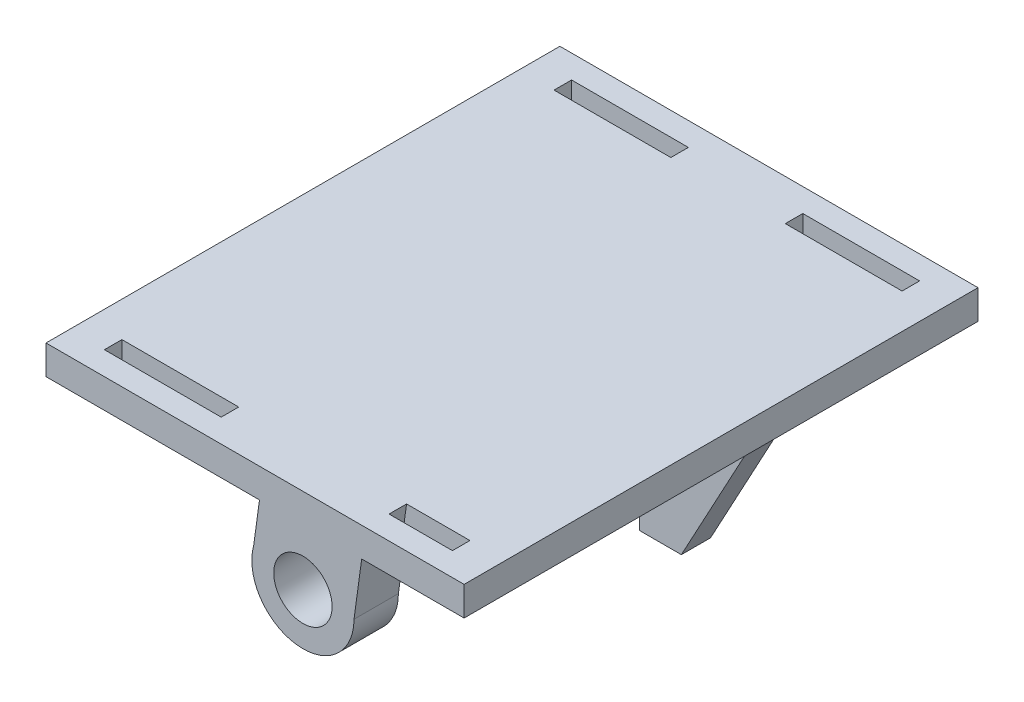
ISO-10303-21;
HEADER;
FILE_DESCRIPTION(('STEP AP214'),'2;1');
FILE_NAME('part.step','',(''),(''),'','','');
FILE_SCHEMA(('AUTOMOTIVE_DESIGN { 1 0 10303 214 1 1 1 1 }'));
ENDSEC;
DATA;
#1=APPLICATION_CONTEXT('core data for automotive mechanical design processes');
#2=APPLICATION_PROTOCOL_DEFINITION('international standard','automotive_design',2000,#1);
#3=PRODUCT_CONTEXT('',#1,'mechanical');
#4=PRODUCT('Part','Part','',(#3));
#5=PRODUCT_RELATED_PRODUCT_CATEGORY('part','',(#4));
#6=PRODUCT_DEFINITION_FORMATION('','',#4);
#7=PRODUCT_DEFINITION_CONTEXT('part definition',#1,'design');
#8=PRODUCT_DEFINITION('design','',#6,#7);
#9=PRODUCT_DEFINITION_SHAPE('','',#8);
#10=(LENGTH_UNIT() NAMED_UNIT(*) SI_UNIT(.MILLI.,.METRE.));
#11=(NAMED_UNIT(*) PLANE_ANGLE_UNIT() SI_UNIT($,.RADIAN.));
#12=(NAMED_UNIT(*) SI_UNIT($,.STERADIAN.) SOLID_ANGLE_UNIT());
#13=UNCERTAINTY_MEASURE_WITH_UNIT(LENGTH_MEASURE(1.E-05),#10,'distance_accuracy_value','');
#14=(GEOMETRIC_REPRESENTATION_CONTEXT(3) GLOBAL_UNCERTAINTY_ASSIGNED_CONTEXT((#13)) GLOBAL_UNIT_ASSIGNED_CONTEXT((#10,
#11,#12)) REPRESENTATION_CONTEXT('',''));
#15=CARTESIAN_POINT('',(0.,0.,0.));
#16=DIRECTION('',(0.,0.,1.));
#17=DIRECTION('',(1.,0.,0.));
#18=AXIS2_PLACEMENT_3D('',#15,#16,#17);
#19=CARTESIAN_POINT('',(0.,0.,0.));
#20=DIRECTION('',(0.,-1.,0.));
#21=DIRECTION('',(0.,0.,-1.));
#22=AXIS2_PLACEMENT_3D('',#19,#20,#21);
#23=PLANE('',#22);
#24=DIRECTION('',(0.,0.,1.));
#25=VECTOR('',#24,1.);
#26=CARTESIAN_POINT('',(34.32750606469,0.,0.));
#27=LINE('',#26,#25);
#28=CARTESIAN_POINT('',(34.32750606469,0.,-2.54));
#29=VERTEX_POINT('',#28);
#30=CARTESIAN_POINT('',(34.32750606469,0.,0.));
#31=VERTEX_POINT('',#30);
#32=EDGE_CURVE('E290',#29,#31,#27,.T.);
#33=ORIENTED_EDGE('',*,*,#32,.F.);
#34=DIRECTION('',(1.,0.,0.));
#35=VECTOR('',#34,1.);
#36=CARTESIAN_POINT('',(41.656,0.,-2.54));
#37=LINE('',#36,#35);
#38=CARTESIAN_POINT('',(41.656,0.,-2.54));
#39=VERTEX_POINT('',#38);
#40=EDGE_CURVE('E446',#29,#39,#37,.T.);
#41=ORIENTED_EDGE('',*,*,#40,.T.);
#42=DIRECTION('',(0.,0.,-1.));
#43=VECTOR('',#42,1.);
#44=CARTESIAN_POINT('',(41.656,0.,-2.54));
#45=LINE('',#44,#43);
#46=CARTESIAN_POINT('',(41.656,0.,-4.445));
#47=VERTEX_POINT('',#46);
#48=EDGE_CURVE('E442',#39,#47,#45,.T.);
#49=ORIENTED_EDGE('',*,*,#48,.T.);
#50=DIRECTION('',(-1.,0.,0.));
#51=VECTOR('',#50,1.);
#52=CARTESIAN_POINT('',(41.656,0.,-4.445));
#53=LINE('',#52,#51);
#54=CARTESIAN_POINT('',(34.32750606469,0.,-4.445));
#55=VERTEX_POINT('',#54);
#56=EDGE_CURVE('E453',#47,#55,#53,.T.);
#57=ORIENTED_EDGE('',*,*,#56,.T.);
#58=CARTESIAN_POINT('',(34.32750606469,0.,-4.826));
#59=VERTEX_POINT('',#58);
#60=EDGE_CURVE('E61',#59,#55,#27,.T.);
#61=ORIENTED_EDGE('',*,*,#60,.F.);
#62=DIRECTION('',(-1.,0.,0.));
#63=VECTOR('',#62,1.);
#64=CARTESIAN_POINT('',(0.,0.,-4.826));
#65=LINE('',#64,#63);
#66=CARTESIAN_POINT('',(23.21500606469,0.,-4.826));
#67=VERTEX_POINT('',#66);
#68=EDGE_CURVE('E56',#59,#67,#65,.T.);
#69=ORIENTED_EDGE('',*,*,#68,.T.);
#70=DIRECTION('',(0.,0.,1.));
#71=VECTOR('',#70,1.);
#72=CARTESIAN_POINT('',(23.21500606469,0.,0.));
#73=LINE('',#72,#71);
#74=CARTESIAN_POINT('',(23.21500606469,0.,0.));
#75=VERTEX_POINT('',#74);
#76=EDGE_CURVE('E265',#67,#75,#73,.T.);
#77=ORIENTED_EDGE('',*,*,#76,.T.);
#78=DIRECTION('',(1.,0.,0.));
#79=VECTOR('',#78,1.);
#80=CARTESIAN_POINT('',(0.,0.,0.));
#81=LINE('',#80,#79);
#82=CARTESIAN_POINT('',(0.,0.,0.));
#83=VERTEX_POINT('',#82);
#84=EDGE_CURVE('E537',#83,#75,#81,.T.);
#85=ORIENTED_EDGE('',*,*,#84,.F.);
#86=DIRECTION('',(0.,0.,1.));
#87=VECTOR('',#86,1.);
#88=CARTESIAN_POINT('',(0.,0.,0.));
#89=LINE('',#88,#87);
#90=CARTESIAN_POINT('',(0.,0.,-30.48));
#91=VERTEX_POINT('',#90);
#92=EDGE_CURVE('E523',#91,#83,#89,.T.);
#93=ORIENTED_EDGE('',*,*,#92,.F.);
#94=DIRECTION('',(1.,0.,0.));
#95=VECTOR('',#94,1.);
#96=CARTESIAN_POINT('',(0.,0.,-30.48));
#97=LINE('',#96,#95);
#98=CARTESIAN_POINT('',(11.43,0.,-30.48));
#99=VERTEX_POINT('',#98);
#100=EDGE_CURVE('E311',#91,#99,#97,.T.);
#101=ORIENTED_EDGE('',*,*,#100,.T.);
#102=DIRECTION('',(0.,0.,-1.));
#103=VECTOR('',#102,1.);
#104=CARTESIAN_POINT('',(11.43,0.,-30.48));
#105=LINE('',#104,#103);
#106=CARTESIAN_POINT('',(11.43,0.,-33.655));
#107=VERTEX_POINT('',#106);
#108=EDGE_CURVE('E318',#99,#107,#105,.T.);
#109=ORIENTED_EDGE('',*,*,#108,.T.);
#110=DIRECTION('',(1.,0.,0.));
#111=VECTOR('',#110,1.);
#112=CARTESIAN_POINT('',(0.,0.,-33.655));
#113=LINE('',#112,#111);
#114=CARTESIAN_POINT('',(0.,0.,-33.655));
#115=VERTEX_POINT('',#114);
#116=EDGE_CURVE('E315',#115,#107,#113,.T.);
#117=ORIENTED_EDGE('',*,*,#116,.F.);
#118=CARTESIAN_POINT('',(0.,0.,-55.88));
#119=VERTEX_POINT('',#118);
#120=EDGE_CURVE('E541',#119,#115,#89,.T.);
#121=ORIENTED_EDGE('',*,*,#120,.F.);
#122=DIRECTION('',(-1.,0.,0.));
#123=VECTOR('',#122,1.);
#124=CARTESIAN_POINT('',(0.,0.,-55.88));
#125=LINE('',#124,#123);
#126=CARTESIAN_POINT('',(45.466,0.,-55.88));
#127=VERTEX_POINT('',#126);
#128=EDGE_CURVE('E528',#127,#119,#125,.T.);
#129=ORIENTED_EDGE('',*,*,#128,.F.);
#130=DIRECTION('',(0.,0.,-1.));
#131=VECTOR('',#130,1.);
#132=CARTESIAN_POINT('',(45.466,0.,0.));
#133=LINE('',#132,#131);
#134=CARTESIAN_POINT('',(45.466,0.,-33.655));
#135=VERTEX_POINT('',#134);
#136=EDGE_CURVE('E545',#135,#127,#133,.T.);
#137=ORIENTED_EDGE('',*,*,#136,.F.);
#138=DIRECTION('',(-1.,0.,0.));
#139=VECTOR('',#138,1.);
#140=CARTESIAN_POINT('',(45.466,0.,-33.655));
#141=LINE('',#140,#139);
#142=CARTESIAN_POINT('',(34.036,0.,-33.655));
#143=VERTEX_POINT('',#142);
#144=EDGE_CURVE('E371',#135,#143,#141,.T.);
#145=ORIENTED_EDGE('',*,*,#144,.T.);
#146=DIRECTION('',(0.,0.,-1.));
#147=VECTOR('',#146,1.);
#148=CARTESIAN_POINT('',(34.036,0.,-30.48));
#149=LINE('',#148,#147);
#150=CARTESIAN_POINT('',(34.036,0.,-30.48));
#151=VERTEX_POINT('',#150);
#152=EDGE_CURVE('E374',#151,#143,#149,.T.);
#153=ORIENTED_EDGE('',*,*,#152,.F.);
#154=DIRECTION('',(-1.,0.,0.));
#155=VECTOR('',#154,1.);
#156=CARTESIAN_POINT('',(45.466,0.,-30.48));
#157=LINE('',#156,#155);
#158=CARTESIAN_POINT('',(45.466,0.,-30.48));
#159=VERTEX_POINT('',#158);
#160=EDGE_CURVE('E367',#159,#151,#157,.T.);
#161=ORIENTED_EDGE('',*,*,#160,.F.);
#162=CARTESIAN_POINT('',(45.466,0.,0.));
#163=VERTEX_POINT('',#162);
#164=EDGE_CURVE('E547',#163,#159,#133,.T.);
#165=ORIENTED_EDGE('',*,*,#164,.F.);
#166=EDGE_CURVE('E544',#31,#163,#81,.T.);
#167=ORIENTED_EDGE('',*,*,#166,.F.);
#168=EDGE_LOOP('',(#33,#41,#49,#57,#61,#69,#77,#85,#93,#101,#109,#117,#121,#129,#137,#145,#153,
#161,#165,#167));
#169=FACE_BOUND('',#168,.T.);
#170=DIRECTION('',(-1.,0.,0.));
#171=VECTOR('',#170,1.);
#172=CARTESIAN_POINT('',(3.81,0.,-53.34));
#173=LINE('',#172,#171);
#174=CARTESIAN_POINT('',(16.51,0.,-53.34));
#175=VERTEX_POINT('',#174);
#176=CARTESIAN_POINT('',(3.81,0.,-53.34));
#177=VERTEX_POINT('',#176);
#178=EDGE_CURVE('E496',#175,#177,#173,.T.);
#179=ORIENTED_EDGE('',*,*,#178,.T.);
#180=DIRECTION('',(0.,0.,1.));
#181=VECTOR('',#180,1.);
#182=CARTESIAN_POINT('',(3.81,0.,-53.34));
#183=LINE('',#182,#181);
#184=CARTESIAN_POINT('',(3.81,0.,-51.435));
#185=VERTEX_POINT('',#184);
#186=EDGE_CURVE('E492',#177,#185,#183,.T.);
#187=ORIENTED_EDGE('',*,*,#186,.T.);
#188=DIRECTION('',(1.,0.,0.));
#189=VECTOR('',#188,1.);
#190=CARTESIAN_POINT('',(3.81,0.,-51.435));
#191=LINE('',#190,#189);
#192=CARTESIAN_POINT('',(16.51,0.,-51.435));
#193=VERTEX_POINT('',#192);
#194=EDGE_CURVE('E506',#185,#193,#191,.T.);
#195=ORIENTED_EDGE('',*,*,#194,.T.);
#196=DIRECTION('',(0.,0.,-1.));
#197=VECTOR('',#196,1.);
#198=CARTESIAN_POINT('',(16.51,0.,-53.34));
#199=LINE('',#198,#197);
#200=EDGE_CURVE('E509',#193,#175,#199,.T.);
#201=ORIENTED_EDGE('',*,*,#200,.T.);
#202=EDGE_LOOP('',(#179,#187,#195,#201));
#203=FACE_BOUND('',#202,.T.);
#204=DIRECTION('',(0.,0.,-1.));
#205=VECTOR('',#204,1.);
#206=CARTESIAN_POINT('',(41.656,0.,-53.34));
#207=LINE('',#206,#205);
#208=CARTESIAN_POINT('',(41.656,0.,-51.435));
#209=VERTEX_POINT('',#208);
#210=CARTESIAN_POINT('',(41.656,0.,-53.34));
#211=VERTEX_POINT('',#210);
#212=EDGE_CURVE('E465',#209,#211,#207,.T.);
#213=ORIENTED_EDGE('',*,*,#212,.T.);
#214=DIRECTION('',(-1.,0.,0.));
#215=VECTOR('',#214,1.);
#216=CARTESIAN_POINT('',(41.656,0.,-53.34));
#217=LINE('',#216,#215);
#218=CARTESIAN_POINT('',(28.956,0.,-53.34));
#219=VERTEX_POINT('',#218);
#220=EDGE_CURVE('E461',#211,#219,#217,.T.);
#221=ORIENTED_EDGE('',*,*,#220,.T.);
#222=DIRECTION('',(0.,0.,1.));
#223=VECTOR('',#222,1.);
#224=CARTESIAN_POINT('',(28.956,0.,-53.34));
#225=LINE('',#224,#223);
#226=CARTESIAN_POINT('',(28.956,0.,-51.435));
#227=VERTEX_POINT('',#226);
#228=EDGE_CURVE('E475',#219,#227,#225,.T.);
#229=ORIENTED_EDGE('',*,*,#228,.T.);
#230=DIRECTION('',(1.,0.,0.));
#231=VECTOR('',#230,1.);
#232=CARTESIAN_POINT('',(41.656,0.,-51.435));
#233=LINE('',#232,#231);
#234=EDGE_CURVE('E478',#227,#209,#233,.T.);
#235=ORIENTED_EDGE('',*,*,#234,.T.);
#236=EDGE_LOOP('',(#213,#221,#229,#235));
#237=FACE_BOUND('',#236,.T.);
#238=DIRECTION('',(0.,0.,1.));
#239=VECTOR('',#238,1.);
#240=CARTESIAN_POINT('',(3.81,0.,-2.54));
#241=LINE('',#240,#239);
#242=CARTESIAN_POINT('',(3.81,0.,-4.445));
#243=VERTEX_POINT('',#242);
#244=CARTESIAN_POINT('',(3.81,0.,-2.54));
#245=VERTEX_POINT('',#244);
#246=EDGE_CURVE('E415',#243,#245,#241,.T.);
#247=ORIENTED_EDGE('',*,*,#246,.T.);
#248=DIRECTION('',(1.,0.,0.));
#249=VECTOR('',#248,1.);
#250=CARTESIAN_POINT('',(3.81,0.,-2.54));
#251=LINE('',#250,#249);
#252=CARTESIAN_POINT('',(16.51,0.,-2.54));
#253=VERTEX_POINT('',#252);
#254=EDGE_CURVE('E370',#245,#253,#251,.T.);
#255=ORIENTED_EDGE('',*,*,#254,.T.);
#256=DIRECTION('',(0.,0.,-1.));
#257=VECTOR('',#256,1.);
#258=CARTESIAN_POINT('',(16.51,0.,-2.54));
#259=LINE('',#258,#257);
#260=CARTESIAN_POINT('',(16.51,0.,-4.445));
#261=VERTEX_POINT('',#260);
#262=EDGE_CURVE('E425',#253,#261,#259,.T.);
#263=ORIENTED_EDGE('',*,*,#262,.T.);
#264=DIRECTION('',(-1.,0.,0.));
#265=VECTOR('',#264,1.);
#266=CARTESIAN_POINT('',(3.81,0.,-4.445));
#267=LINE('',#266,#265);
#268=EDGE_CURVE('E428',#261,#243,#267,.T.);
#269=ORIENTED_EDGE('',*,*,#268,.T.);
#270=EDGE_LOOP('',(#247,#255,#263,#269));
#271=FACE_BOUND('',#270,.T.);
#272=ADVANCED_FACE('F41',(#169,#203,#237,#271),#23,.T.);
#273=CARTESIAN_POINT('',(0.,3.175,0.));
#274=DIRECTION('',(0.,-1.,0.));
#275=DIRECTION('',(0.,0.,-1.));
#276=AXIS2_PLACEMENT_3D('',#273,#274,#275);
#277=PLANE('',#276);
#278=DIRECTION('',(1.,0.,0.));
#279=VECTOR('',#278,1.);
#280=CARTESIAN_POINT('',(0.,3.175,0.));
#281=LINE('',#280,#279);
#282=CARTESIAN_POINT('',(0.,3.175,0.));
#283=VERTEX_POINT('',#282);
#284=CARTESIAN_POINT('',(45.466,3.175,0.));
#285=VERTEX_POINT('',#284);
#286=EDGE_CURVE('E527',#283,#285,#281,.T.);
#287=ORIENTED_EDGE('',*,*,#286,.T.);
#288=DIRECTION('',(0.,0.,-1.));
#289=VECTOR('',#288,1.);
#290=CARTESIAN_POINT('',(45.466,3.175,0.));
#291=LINE('',#290,#289);
#292=CARTESIAN_POINT('',(45.466,3.175,-55.88));
#293=VERTEX_POINT('',#292);
#294=EDGE_CURVE('E530',#285,#293,#291,.T.);
#295=ORIENTED_EDGE('',*,*,#294,.T.);
#296=DIRECTION('',(-1.,0.,0.));
#297=VECTOR('',#296,1.);
#298=CARTESIAN_POINT('',(0.,3.175,-55.88));
#299=LINE('',#298,#297);
#300=CARTESIAN_POINT('',(0.,3.175,-55.88));
#301=VERTEX_POINT('',#300);
#302=EDGE_CURVE('E532',#293,#301,#299,.T.);
#303=ORIENTED_EDGE('',*,*,#302,.T.);
#304=DIRECTION('',(0.,0.,1.));
#305=VECTOR('',#304,1.);
#306=CARTESIAN_POINT('',(0.,3.175,0.));
#307=LINE('',#306,#305);
#308=EDGE_CURVE('E524',#301,#283,#307,.T.);
#309=ORIENTED_EDGE('',*,*,#308,.T.);
#310=EDGE_LOOP('',(#287,#295,#303,#309));
#311=FACE_BOUND('',#310,.T.);
#312=DIRECTION('',(0.,0.,1.));
#313=VECTOR('',#312,1.);
#314=CARTESIAN_POINT('',(34.76225,3.175,-4.826));
#315=LINE('',#314,#313);
#316=CARTESIAN_POINT('',(34.76225,3.175,-4.445));
#317=VERTEX_POINT('',#316);
#318=CARTESIAN_POINT('',(34.76225,3.175,-2.54));
#319=VERTEX_POINT('',#318);
#320=EDGE_CURVE('E287',#317,#319,#315,.T.);
#321=ORIENTED_EDGE('',*,*,#320,.F.);
#322=DIRECTION('',(-1.,0.,0.));
#323=VECTOR('',#322,1.);
#324=CARTESIAN_POINT('',(41.656,3.175,-4.445));
#325=LINE('',#324,#323);
#326=CARTESIAN_POINT('',(41.656,3.175,-4.445));
#327=VERTEX_POINT('',#326);
#328=EDGE_CURVE('E445',#327,#317,#325,.T.);
#329=ORIENTED_EDGE('',*,*,#328,.F.);
#330=DIRECTION('',(0.,0.,-1.));
#331=VECTOR('',#330,1.);
#332=CARTESIAN_POINT('',(41.656,3.175,-2.54));
#333=LINE('',#332,#331);
#334=CARTESIAN_POINT('',(41.656,3.175,-2.54));
#335=VERTEX_POINT('',#334);
#336=EDGE_CURVE('E443',#335,#327,#333,.T.);
#337=ORIENTED_EDGE('',*,*,#336,.F.);
#338=DIRECTION('',(1.,0.,0.));
#339=VECTOR('',#338,1.);
#340=CARTESIAN_POINT('',(41.656,3.175,-2.54));
#341=LINE('',#340,#339);
#342=EDGE_CURVE('E448',#319,#335,#341,.T.);
#343=ORIENTED_EDGE('',*,*,#342,.F.);
#344=EDGE_LOOP('',(#321,#329,#337,#343));
#345=FACE_BOUND('',#344,.T.);
#346=DIRECTION('',(0.,0.,1.));
#347=VECTOR('',#346,1.);
#348=CARTESIAN_POINT('',(3.81,3.175,-53.34));
#349=LINE('',#348,#347);
#350=CARTESIAN_POINT('',(3.81,3.175,-53.34));
#351=VERTEX_POINT('',#350);
#352=CARTESIAN_POINT('',(3.81,3.175,-51.435));
#353=VERTEX_POINT('',#352);
#354=EDGE_CURVE('E493',#351,#353,#349,.T.);
#355=ORIENTED_EDGE('',*,*,#354,.F.);
#356=DIRECTION('',(-1.,0.,0.));
#357=VECTOR('',#356,1.);
#358=CARTESIAN_POINT('',(3.81,3.175,-53.34));
#359=LINE('',#358,#357);
#360=CARTESIAN_POINT('',(16.51,3.175,-53.34));
#361=VERTEX_POINT('',#360);
#362=EDGE_CURVE('E501',#361,#351,#359,.T.);
#363=ORIENTED_EDGE('',*,*,#362,.F.);
#364=DIRECTION('',(0.,0.,-1.));
#365=VECTOR('',#364,1.);
#366=CARTESIAN_POINT('',(16.51,3.175,-53.34));
#367=LINE('',#366,#365);
#368=CARTESIAN_POINT('',(16.51,3.175,-51.435));
#369=VERTEX_POINT('',#368);
#370=EDGE_CURVE('E498',#369,#361,#367,.T.);
#371=ORIENTED_EDGE('',*,*,#370,.F.);
#372=DIRECTION('',(1.,0.,0.));
#373=VECTOR('',#372,1.);
#374=CARTESIAN_POINT('',(3.81,3.175,-51.435));
#375=LINE('',#374,#373);
#376=EDGE_CURVE('E495',#353,#369,#375,.T.);
#377=ORIENTED_EDGE('',*,*,#376,.F.);
#378=EDGE_LOOP('',(#355,#363,#371,#377));
#379=FACE_BOUND('',#378,.T.);
#380=DIRECTION('',(-1.,0.,0.));
#381=VECTOR('',#380,1.);
#382=CARTESIAN_POINT('',(41.656,3.175,-53.34));
#383=LINE('',#382,#381);
#384=CARTESIAN_POINT('',(41.656,3.175,-53.34));
#385=VERTEX_POINT('',#384);
#386=CARTESIAN_POINT('',(28.956,3.175,-53.34));
#387=VERTEX_POINT('',#386);
#388=EDGE_CURVE('E462',#385,#387,#383,.T.);
#389=ORIENTED_EDGE('',*,*,#388,.F.);
#390=DIRECTION('',(0.,0.,-1.));
#391=VECTOR('',#390,1.);
#392=CARTESIAN_POINT('',(41.656,3.175,-53.34));
#393=LINE('',#392,#391);
#394=CARTESIAN_POINT('',(41.656,3.175,-51.435));
#395=VERTEX_POINT('',#394);
#396=EDGE_CURVE('E470',#395,#385,#393,.T.);
#397=ORIENTED_EDGE('',*,*,#396,.F.);
#398=DIRECTION('',(1.,0.,0.));
#399=VECTOR('',#398,1.);
#400=CARTESIAN_POINT('',(41.656,3.175,-51.435));
#401=LINE('',#400,#399);
#402=CARTESIAN_POINT('',(28.956,3.175,-51.435));
#403=VERTEX_POINT('',#402);
#404=EDGE_CURVE('E467',#403,#395,#401,.T.);
#405=ORIENTED_EDGE('',*,*,#404,.F.);
#406=DIRECTION('',(0.,0.,1.));
#407=VECTOR('',#406,1.);
#408=CARTESIAN_POINT('',(28.956,3.175,-53.34));
#409=LINE('',#408,#407);
#410=EDGE_CURVE('E464',#387,#403,#409,.T.);
#411=ORIENTED_EDGE('',*,*,#410,.F.);
#412=EDGE_LOOP('',(#389,#397,#405,#411));
#413=FACE_BOUND('',#412,.T.);
#414=DIRECTION('',(1.,0.,0.));
#415=VECTOR('',#414,1.);
#416=CARTESIAN_POINT('',(3.81,3.175,-2.54));
#417=LINE('',#416,#415);
#418=CARTESIAN_POINT('',(3.81,3.175,-2.54));
#419=VERTEX_POINT('',#418);
#420=CARTESIAN_POINT('',(16.51,3.175,-2.54));
#421=VERTEX_POINT('',#420);
#422=EDGE_CURVE('E412',#419,#421,#417,.T.);
#423=ORIENTED_EDGE('',*,*,#422,.F.);
#424=DIRECTION('',(0.,0.,1.));
#425=VECTOR('',#424,1.);
#426=CARTESIAN_POINT('',(3.81,3.175,-2.54));
#427=LINE('',#426,#425);
#428=CARTESIAN_POINT('',(3.81,3.175,-4.445));
#429=VERTEX_POINT('',#428);
#430=EDGE_CURVE('E420',#429,#419,#427,.T.);
#431=ORIENTED_EDGE('',*,*,#430,.F.);
#432=DIRECTION('',(-1.,0.,0.));
#433=VECTOR('',#432,1.);
#434=CARTESIAN_POINT('',(3.81,3.175,-4.445));
#435=LINE('',#434,#433);
#436=CARTESIAN_POINT('',(16.51,3.175,-4.445));
#437=VERTEX_POINT('',#436);
#438=EDGE_CURVE('E417',#437,#429,#435,.T.);
#439=ORIENTED_EDGE('',*,*,#438,.F.);
#440=DIRECTION('',(0.,0.,-1.));
#441=VECTOR('',#440,1.);
#442=CARTESIAN_POINT('',(16.51,3.175,-2.54));
#443=LINE('',#442,#441);
#444=EDGE_CURVE('E414',#421,#437,#443,.T.);
#445=ORIENTED_EDGE('',*,*,#444,.F.);
#446=EDGE_LOOP('',(#423,#431,#439,#445));
#447=FACE_BOUND('',#446,.T.);
#448=ADVANCED_FACE('F618',(#311,#345,#379,#413,#447),#277,.F.);
#449=CARTESIAN_POINT('',(0.,3.175,0.));
#450=DIRECTION('',(1.,0.,0.));
#451=DIRECTION('',(0.,0.,-1.));
#452=AXIS2_PLACEMENT_3D('',#449,#450,#451);
#453=PLANE('',#452);
#454=ORIENTED_EDGE('',*,*,#120,.T.);
#455=DIRECTION('',(0.,0.,-1.));
#456=VECTOR('',#455,1.);
#457=CARTESIAN_POINT('',(0.,0.,-30.48));
#458=LINE('',#457,#456);
#459=EDGE_CURVE('E300',#91,#115,#458,.T.);
#460=ORIENTED_EDGE('',*,*,#459,.F.);
#461=ORIENTED_EDGE('',*,*,#92,.T.);
#462=DIRECTION('',(0.,-1.,0.));
#463=VECTOR('',#462,1.);
#464=CARTESIAN_POINT('',(0.,3.175,0.));
#465=LINE('',#464,#463);
#466=EDGE_CURVE('E49',#283,#83,#465,.T.);
#467=ORIENTED_EDGE('',*,*,#466,.F.);
#468=ORIENTED_EDGE('',*,*,#308,.F.);
#469=DIRECTION('',(0.,-1.,0.));
#470=VECTOR('',#469,1.);
#471=CARTESIAN_POINT('',(0.,3.175,-55.88));
#472=LINE('',#471,#470);
#473=EDGE_CURVE('E534',#301,#119,#472,.T.);
#474=ORIENTED_EDGE('',*,*,#473,.T.);
#475=EDGE_LOOP('',(#454,#460,#461,#467,#468,#474));
#476=FACE_BOUND('',#475,.T.);
#477=ADVANCED_FACE('F43',(#476),#453,.F.);
#478=CARTESIAN_POINT('',(0.,3.175,0.));
#479=DIRECTION('',(0.,0.,-1.));
#480=DIRECTION('',(-1.,0.,0.));
#481=AXIS2_PLACEMENT_3D('',#478,#479,#480);
#482=PLANE('',#481);
#483=DIRECTION('',(0.,-1.,0.));
#484=VECTOR('',#483,1.);
#485=CARTESIAN_POINT('',(45.466,3.175,0.));
#486=LINE('',#485,#484);
#487=EDGE_CURVE('E558',#285,#163,#486,.T.);
#488=ORIENTED_EDGE('',*,*,#487,.F.);
#489=ORIENTED_EDGE('',*,*,#286,.F.);
#490=ORIENTED_EDGE('',*,*,#466,.T.);
#491=ORIENTED_EDGE('',*,*,#84,.T.);
#492=DIRECTION('',(0.13566136769698,0.990755264086235,0.));
#493=VECTOR('',#492,1.);
#494=CARTESIAN_POINT('',(22.7877569378735,-3.12026429230174,0.));
#495=LINE('',#494,#493);
#496=CARTESIAN_POINT('',(22.5842645242917,-4.60639983243681,0.));
#497=VERTEX_POINT('',#496);
#498=EDGE_CURVE('E279',#497,#75,#495,.T.);
#499=ORIENTED_EDGE('',*,*,#498,.F.);
#500=CARTESIAN_POINT('',(27.936,-6.10000000000004,0.));
#501=DIRECTION('',(0.,0.,1.));
#502=DIRECTION('',(1.,0.,0.));
#503=AXIS2_PLACEMENT_3D('',#500,#501,#502);
#504=CIRCLE('',#503,5.55625);
#505=CARTESIAN_POINT('',(33.49225,-6.10000000000004,0.));
#506=VERTEX_POINT('',#505);
#507=EDGE_CURVE('E255',#497,#506,#504,.T.);
#508=ORIENTED_EDGE('',*,*,#507,.T.);
#509=DIRECTION('',(0.135661367696981,0.990755264086235,0.));
#510=VECTOR('',#509,1.);
#511=CARTESIAN_POINT('',(33.6957424135818,-4.61386445986504,0.));
#512=LINE('',#511,#510);
#513=EDGE_CURVE('E282',#506,#31,#512,.T.);
#514=ORIENTED_EDGE('',*,*,#513,.T.);
#515=ORIENTED_EDGE('',*,*,#166,.T.);
#516=EDGE_LOOP('',(#488,#489,#490,#491,#499,#508,#514,#515));
#517=FACE_BOUND('',#516,.T.);
#518=CARTESIAN_POINT('',(27.936,-6.10000000000004,0.));
#519=DIRECTION('',(0.,0.,1.));
#520=DIRECTION('',(1.,0.,0.));
#521=AXIS2_PLACEMENT_3D('',#518,#519,#520);
#522=CIRCLE('',#521,3.175);
#523=CARTESIAN_POINT('',(31.111,-6.10000000000004,0.));
#524=VERTEX_POINT('',#523);
#525=EDGE_CURVE('E267',#524,#524,#522,.T.);
#526=ORIENTED_EDGE('',*,*,#525,.F.);
#527=EDGE_LOOP('',(#526));
#528=FACE_BOUND('',#527,.T.);
#529=ADVANCED_FACE('F565',(#517,#528),#482,.F.);
#530=CARTESIAN_POINT('',(45.466,3.175,0.));
#531=DIRECTION('',(-1.,0.,0.));
#532=DIRECTION('',(0.,0.,1.));
#533=AXIS2_PLACEMENT_3D('',#530,#531,#532);
#534=PLANE('',#533);
#535=ORIENTED_EDGE('',*,*,#164,.T.);
#536=DIRECTION('',(0.,0.,-1.));
#537=VECTOR('',#536,1.);
#538=CARTESIAN_POINT('',(45.466,0.,-30.48));
#539=LINE('',#538,#537);
#540=EDGE_CURVE('E355',#159,#135,#539,.T.);
#541=ORIENTED_EDGE('',*,*,#540,.T.);
#542=ORIENTED_EDGE('',*,*,#136,.T.);
#543=DIRECTION('',(0.,-1.,0.));
#544=VECTOR('',#543,1.);
#545=CARTESIAN_POINT('',(45.466,3.175,-55.88));
#546=LINE('',#545,#544);
#547=EDGE_CURVE('E555',#293,#127,#546,.T.);
#548=ORIENTED_EDGE('',*,*,#547,.F.);
#549=ORIENTED_EDGE('',*,*,#294,.F.);
#550=ORIENTED_EDGE('',*,*,#487,.T.);
#551=EDGE_LOOP('',(#535,#541,#542,#548,#549,#550));
#552=FACE_BOUND('',#551,.T.);
#553=ADVANCED_FACE('F579',(#552),#534,.F.);
#554=CARTESIAN_POINT('',(0.,3.175,-55.88));
#555=DIRECTION('',(0.,0.,1.));
#556=DIRECTION('',(1.,0.,0.));
#557=AXIS2_PLACEMENT_3D('',#554,#555,#556);
#558=PLANE('',#557);
#559=ORIENTED_EDGE('',*,*,#128,.T.);
#560=ORIENTED_EDGE('',*,*,#473,.F.);
#561=ORIENTED_EDGE('',*,*,#302,.F.);
#562=ORIENTED_EDGE('',*,*,#547,.T.);
#563=EDGE_LOOP('',(#559,#560,#561,#562));
#564=FACE_BOUND('',#563,.T.);
#565=ADVANCED_FACE('F627',(#564),#558,.F.);
#566=CARTESIAN_POINT('',(3.81,3.175,-53.34));
#567=DIRECTION('',(1.,0.,0.));
#568=DIRECTION('',(0.,0.,-1.));
#569=AXIS2_PLACEMENT_3D('',#566,#567,#568);
#570=PLANE('',#569);
#571=ORIENTED_EDGE('',*,*,#186,.F.);
#572=DIRECTION('',(0.,-1.,0.));
#573=VECTOR('',#572,1.);
#574=CARTESIAN_POINT('',(3.81,3.175,-53.34));
#575=LINE('',#574,#573);
#576=EDGE_CURVE('E503',#351,#177,#575,.T.);
#577=ORIENTED_EDGE('',*,*,#576,.F.);
#578=ORIENTED_EDGE('',*,*,#354,.T.);
#579=DIRECTION('',(0.,-1.,0.));
#580=VECTOR('',#579,1.);
#581=CARTESIAN_POINT('',(3.81,3.175,-51.435));
#582=LINE('',#581,#580);
#583=EDGE_CURVE('E520',#353,#185,#582,.T.);
#584=ORIENTED_EDGE('',*,*,#583,.T.);
#585=EDGE_LOOP('',(#571,#577,#578,#584));
#586=FACE_BOUND('',#585,.T.);
#587=ADVANCED_FACE('F630',(#586),#570,.T.);
#588=CARTESIAN_POINT('',(3.81,3.175,-51.435));
#589=DIRECTION('',(0.,0.,-1.));
#590=DIRECTION('',(-1.,0.,0.));
#591=AXIS2_PLACEMENT_3D('',#588,#589,#590);
#592=PLANE('',#591);
#593=ORIENTED_EDGE('',*,*,#194,.F.);
#594=ORIENTED_EDGE('',*,*,#583,.F.);
#595=ORIENTED_EDGE('',*,*,#376,.T.);
#596=DIRECTION('',(0.,-1.,0.));
#597=VECTOR('',#596,1.);
#598=CARTESIAN_POINT('',(16.51,3.175,-51.435));
#599=LINE('',#598,#597);
#600=EDGE_CURVE('E518',#369,#193,#599,.T.);
#601=ORIENTED_EDGE('',*,*,#600,.T.);
#602=EDGE_LOOP('',(#593,#594,#595,#601));
#603=FACE_BOUND('',#602,.T.);
#604=ADVANCED_FACE('F798',(#603),#592,.T.);
#605=CARTESIAN_POINT('',(16.51,3.175,-53.34));
#606=DIRECTION('',(-1.,0.,0.));
#607=DIRECTION('',(0.,0.,1.));
#608=AXIS2_PLACEMENT_3D('',#605,#606,#607);
#609=PLANE('',#608);
#610=ORIENTED_EDGE('',*,*,#200,.F.);
#611=ORIENTED_EDGE('',*,*,#600,.F.);
#612=ORIENTED_EDGE('',*,*,#370,.T.);
#613=DIRECTION('',(0.,-1.,0.));
#614=VECTOR('',#613,1.);
#615=CARTESIAN_POINT('',(16.51,3.175,-53.34));
#616=LINE('',#615,#614);
#617=EDGE_CURVE('E516',#361,#175,#616,.T.);
#618=ORIENTED_EDGE('',*,*,#617,.T.);
#619=EDGE_LOOP('',(#610,#611,#612,#618));
#620=FACE_BOUND('',#619,.T.);
#621=ADVANCED_FACE('F794',(#620),#609,.T.);
#622=CARTESIAN_POINT('',(3.81,3.175,-53.34));
#623=DIRECTION('',(0.,0.,1.));
#624=DIRECTION('',(1.,0.,0.));
#625=AXIS2_PLACEMENT_3D('',#622,#623,#624);
#626=PLANE('',#625);
#627=ORIENTED_EDGE('',*,*,#178,.F.);
#628=ORIENTED_EDGE('',*,*,#617,.F.);
#629=ORIENTED_EDGE('',*,*,#362,.T.);
#630=ORIENTED_EDGE('',*,*,#576,.T.);
#631=EDGE_LOOP('',(#627,#628,#629,#630));
#632=FACE_BOUND('',#631,.T.);
#633=ADVANCED_FACE('F790',(#632),#626,.T.);
#634=CARTESIAN_POINT('',(41.656,3.175,-53.34));
#635=DIRECTION('',(0.,0.,1.));
#636=DIRECTION('',(1.,0.,0.));
#637=AXIS2_PLACEMENT_3D('',#634,#635,#636);
#638=PLANE('',#637);
#639=ORIENTED_EDGE('',*,*,#220,.F.);
#640=DIRECTION('',(0.,-1.,0.));
#641=VECTOR('',#640,1.);
#642=CARTESIAN_POINT('',(41.656,3.175,-53.34));
#643=LINE('',#642,#641);
#644=EDGE_CURVE('E472',#385,#211,#643,.T.);
#645=ORIENTED_EDGE('',*,*,#644,.F.);
#646=ORIENTED_EDGE('',*,*,#388,.T.);
#647=DIRECTION('',(0.,-1.,0.));
#648=VECTOR('',#647,1.);
#649=CARTESIAN_POINT('',(28.956,3.175,-53.34));
#650=LINE('',#649,#648);
#651=EDGE_CURVE('E489',#387,#219,#650,.T.);
#652=ORIENTED_EDGE('',*,*,#651,.T.);
#653=EDGE_LOOP('',(#639,#645,#646,#652));
#654=FACE_BOUND('',#653,.T.);
#655=ADVANCED_FACE('F786',(#654),#638,.T.);
#656=CARTESIAN_POINT('',(28.956,3.175,-53.34));
#657=DIRECTION('',(1.,0.,0.));
#658=DIRECTION('',(0.,0.,-1.));
#659=AXIS2_PLACEMENT_3D('',#656,#657,#658);
#660=PLANE('',#659);
#661=ORIENTED_EDGE('',*,*,#228,.F.);
#662=ORIENTED_EDGE('',*,*,#651,.F.);
#663=ORIENTED_EDGE('',*,*,#410,.T.);
#664=DIRECTION('',(0.,-1.,0.));
#665=VECTOR('',#664,1.);
#666=CARTESIAN_POINT('',(28.956,3.175,-51.435));
#667=LINE('',#666,#665);
#668=EDGE_CURVE('E487',#403,#227,#667,.T.);
#669=ORIENTED_EDGE('',*,*,#668,.T.);
#670=EDGE_LOOP('',(#661,#662,#663,#669));
#671=FACE_BOUND('',#670,.T.);
#672=ADVANCED_FACE('F782',(#671),#660,.T.);
#673=CARTESIAN_POINT('',(41.656,3.175,-51.435));
#674=DIRECTION('',(0.,0.,-1.));
#675=DIRECTION('',(-1.,0.,0.));
#676=AXIS2_PLACEMENT_3D('',#673,#674,#675);
#677=PLANE('',#676);
#678=ORIENTED_EDGE('',*,*,#234,.F.);
#679=ORIENTED_EDGE('',*,*,#668,.F.);
#680=ORIENTED_EDGE('',*,*,#404,.T.);
#681=DIRECTION('',(0.,-1.,0.));
#682=VECTOR('',#681,1.);
#683=CARTESIAN_POINT('',(41.656,3.175,-51.435));
#684=LINE('',#683,#682);
#685=EDGE_CURVE('E485',#395,#209,#684,.T.);
#686=ORIENTED_EDGE('',*,*,#685,.T.);
#687=EDGE_LOOP('',(#678,#679,#680,#686));
#688=FACE_BOUND('',#687,.T.);
#689=ADVANCED_FACE('F778',(#688),#677,.T.);
#690=CARTESIAN_POINT('',(41.656,3.175,-53.34));
#691=DIRECTION('',(-1.,0.,0.));
#692=DIRECTION('',(0.,0.,1.));
#693=AXIS2_PLACEMENT_3D('',#690,#691,#692);
#694=PLANE('',#693);
#695=ORIENTED_EDGE('',*,*,#212,.F.);
#696=ORIENTED_EDGE('',*,*,#685,.F.);
#697=ORIENTED_EDGE('',*,*,#396,.T.);
#698=ORIENTED_EDGE('',*,*,#644,.T.);
#699=EDGE_LOOP('',(#695,#696,#697,#698));
#700=FACE_BOUND('',#699,.T.);
#701=ADVANCED_FACE('F774',(#700),#694,.T.);
#702=CARTESIAN_POINT('',(41.656,3.175,-2.54));
#703=DIRECTION('',(-1.,0.,0.));
#704=DIRECTION('',(0.,0.,1.));
#705=AXIS2_PLACEMENT_3D('',#702,#703,#704);
#706=PLANE('',#705);
#707=ORIENTED_EDGE('',*,*,#48,.F.);
#708=DIRECTION('',(0.,-1.,0.));
#709=VECTOR('',#708,1.);
#710=CARTESIAN_POINT('',(41.656,3.175,-2.54));
#711=LINE('',#710,#709);
#712=EDGE_CURVE('E450',#335,#39,#711,.T.);
#713=ORIENTED_EDGE('',*,*,#712,.F.);
#714=ORIENTED_EDGE('',*,*,#336,.T.);
#715=DIRECTION('',(0.,-1.,0.));
#716=VECTOR('',#715,1.);
#717=CARTESIAN_POINT('',(41.656,3.175,-4.445));
#718=LINE('',#717,#716);
#719=EDGE_CURVE('E458',#327,#47,#718,.T.);
#720=ORIENTED_EDGE('',*,*,#719,.T.);
#721=EDGE_LOOP('',(#707,#713,#714,#720));
#722=FACE_BOUND('',#721,.T.);
#723=ADVANCED_FACE('F668',(#722),#706,.T.);
#724=CARTESIAN_POINT('',(41.656,3.175,-4.445));
#725=DIRECTION('',(0.,0.,1.));
#726=DIRECTION('',(1.,0.,0.));
#727=AXIS2_PLACEMENT_3D('',#724,#725,#726);
#728=PLANE('',#727);
#729=DIRECTION('',(0.135661367696981,0.990755264086235,0.));
#730=VECTOR('',#729,1.);
#731=CARTESIAN_POINT('',(34.8891226210876,4.10156973274595,-4.445));
#732=LINE('',#731,#730);
#733=EDGE_CURVE('E294',#55,#317,#732,.T.);
#734=ORIENTED_EDGE('',*,*,#733,.F.);
#735=ORIENTED_EDGE('',*,*,#56,.F.);
#736=ORIENTED_EDGE('',*,*,#719,.F.);
#737=ORIENTED_EDGE('',*,*,#328,.T.);
#738=EDGE_LOOP('',(#734,#735,#736,#737));
#739=FACE_BOUND('',#738,.T.);
#740=ADVANCED_FACE('F662',(#739),#728,.T.);
#741=CARTESIAN_POINT('',(41.656,3.175,-2.54));
#742=DIRECTION('',(0.,0.,-1.));
#743=DIRECTION('',(-1.,0.,0.));
#744=AXIS2_PLACEMENT_3D('',#741,#742,#743);
#745=PLANE('',#744);
#746=DIRECTION('',(-0.135661367696981,-0.990755264086235,0.));
#747=VECTOR('',#746,1.);
#748=CARTESIAN_POINT('',(34.8891226210876,4.10156973274595,-2.54));
#749=LINE('',#748,#747);
#750=EDGE_CURVE('E12',#319,#29,#749,.T.);
#751=ORIENTED_EDGE('',*,*,#750,.F.);
#752=ORIENTED_EDGE('',*,*,#342,.T.);
#753=ORIENTED_EDGE('',*,*,#712,.T.);
#754=ORIENTED_EDGE('',*,*,#40,.F.);
#755=EDGE_LOOP('',(#751,#752,#753,#754));
#756=FACE_BOUND('',#755,.T.);
#757=ADVANCED_FACE('F667',(#756),#745,.T.);
#758=CARTESIAN_POINT('',(3.81,3.175,-2.54));
#759=DIRECTION('',(0.,0.,-1.));
#760=DIRECTION('',(-1.,0.,0.));
#761=AXIS2_PLACEMENT_3D('',#758,#759,#760);
#762=PLANE('',#761);
#763=ORIENTED_EDGE('',*,*,#254,.F.);
#764=DIRECTION('',(0.,-1.,0.));
#765=VECTOR('',#764,1.);
#766=CARTESIAN_POINT('',(3.81,3.175,-2.54));
#767=LINE('',#766,#765);
#768=EDGE_CURVE('E422',#419,#245,#767,.T.);
#769=ORIENTED_EDGE('',*,*,#768,.F.);
#770=ORIENTED_EDGE('',*,*,#422,.T.);
#771=DIRECTION('',(0.,-1.,0.));
#772=VECTOR('',#771,1.);
#773=CARTESIAN_POINT('',(16.51,3.175,-2.54));
#774=LINE('',#773,#772);
#775=EDGE_CURVE('E439',#421,#253,#774,.T.);
#776=ORIENTED_EDGE('',*,*,#775,.T.);
#777=EDGE_LOOP('',(#763,#769,#770,#776));
#778=FACE_BOUND('',#777,.T.);
#779=ADVANCED_FACE('F680',(#778),#762,.T.);
#780=CARTESIAN_POINT('',(16.51,3.175,-2.54));
#781=DIRECTION('',(-1.,0.,0.));
#782=DIRECTION('',(0.,0.,1.));
#783=AXIS2_PLACEMENT_3D('',#780,#781,#782);
#784=PLANE('',#783);
#785=ORIENTED_EDGE('',*,*,#262,.F.);
#786=ORIENTED_EDGE('',*,*,#775,.F.);
#787=ORIENTED_EDGE('',*,*,#444,.T.);
#788=DIRECTION('',(0.,-1.,0.));
#789=VECTOR('',#788,1.);
#790=CARTESIAN_POINT('',(16.51,3.175,-4.445));
#791=LINE('',#790,#789);
#792=EDGE_CURVE('E437',#437,#261,#791,.T.);
#793=ORIENTED_EDGE('',*,*,#792,.T.);
#794=EDGE_LOOP('',(#785,#786,#787,#793));
#795=FACE_BOUND('',#794,.T.);
#796=ADVANCED_FACE('F766',(#795),#784,.T.);
#797=CARTESIAN_POINT('',(3.81,3.175,-4.445));
#798=DIRECTION('',(0.,0.,1.));
#799=DIRECTION('',(1.,0.,0.));
#800=AXIS2_PLACEMENT_3D('',#797,#798,#799);
#801=PLANE('',#800);
#802=ORIENTED_EDGE('',*,*,#268,.F.);
#803=ORIENTED_EDGE('',*,*,#792,.F.);
#804=ORIENTED_EDGE('',*,*,#438,.T.);
#805=DIRECTION('',(0.,-1.,0.));
#806=VECTOR('',#805,1.);
#807=CARTESIAN_POINT('',(3.81,3.175,-4.445));
#808=LINE('',#807,#806);
#809=EDGE_CURVE('E435',#429,#243,#808,.T.);
#810=ORIENTED_EDGE('',*,*,#809,.T.);
#811=EDGE_LOOP('',(#802,#803,#804,#810));
#812=FACE_BOUND('',#811,.T.);
#813=ADVANCED_FACE('F614',(#812),#801,.T.);
#814=CARTESIAN_POINT('',(3.81,3.175,-2.54));
#815=DIRECTION('',(1.,0.,0.));
#816=DIRECTION('',(0.,0.,-1.));
#817=AXIS2_PLACEMENT_3D('',#814,#815,#816);
#818=PLANE('',#817);
#819=ORIENTED_EDGE('',*,*,#246,.F.);
#820=ORIENTED_EDGE('',*,*,#809,.F.);
#821=ORIENTED_EDGE('',*,*,#430,.T.);
#822=ORIENTED_EDGE('',*,*,#768,.T.);
#823=EDGE_LOOP('',(#819,#820,#821,#822));
#824=FACE_BOUND('',#823,.T.);
#825=ADVANCED_FACE('F603',(#824),#818,.T.);
#826=CARTESIAN_POINT('',(0.,0.,-33.655));
#827=DIRECTION('',(0.,0.,1.));
#828=DIRECTION('',(1.,0.,0.));
#829=AXIS2_PLACEMENT_3D('',#826,#827,#828);
#830=PLANE('',#829);
#831=DIRECTION('',(0.475148914734884,0.879905397657193,0.));
#832=VECTOR('',#831,1.);
#833=CARTESIAN_POINT('',(38.608,-12.7,-33.655));
#834=LINE('',#833,#832);
#835=CARTESIAN_POINT('',(38.608,-12.7,-33.655));
#836=VERTEX_POINT('',#835);
#837=EDGE_CURVE('E314',#836,#135,#834,.T.);
#838=ORIENTED_EDGE('',*,*,#837,.F.);
#839=DIRECTION('',(1.,0.,0.));
#840=VECTOR('',#839,1.);
#841=CARTESIAN_POINT('',(34.036,-12.7,-33.655));
#842=LINE('',#841,#840);
#843=CARTESIAN_POINT('',(34.036,-12.7,-33.655));
#844=VERTEX_POINT('',#843);
#845=EDGE_CURVE('E358',#844,#836,#842,.T.);
#846=ORIENTED_EDGE('',*,*,#845,.F.);
#847=DIRECTION('',(0.,-1.,0.));
#848=VECTOR('',#847,1.);
#849=CARTESIAN_POINT('',(34.036,0.,-33.655));
#850=LINE('',#849,#848);
#851=EDGE_CURVE('E378',#143,#844,#850,.T.);
#852=ORIENTED_EDGE('',*,*,#851,.F.);
#853=ORIENTED_EDGE('',*,*,#144,.F.);
#854=EDGE_LOOP('',(#838,#846,#852,#853));
#855=FACE_BOUND('',#854,.T.);
#856=ADVANCED_FACE('F595',(#855),#830,.F.);
#857=CARTESIAN_POINT('',(0.,0.,-30.48));
#858=DIRECTION('',(0.,0.,1.));
#859=DIRECTION('',(1.,0.,0.));
#860=AXIS2_PLACEMENT_3D('',#857,#858,#859);
#861=PLANE('',#860);
#862=DIRECTION('',(0.475148914734884,0.879905397657193,0.));
#863=VECTOR('',#862,1.);
#864=CARTESIAN_POINT('',(38.608,-12.7,-30.48));
#865=LINE('',#864,#863);
#866=CARTESIAN_POINT('',(38.608,-12.7,-30.48));
#867=VERTEX_POINT('',#866);
#868=EDGE_CURVE('E359',#867,#159,#865,.T.);
#869=ORIENTED_EDGE('',*,*,#868,.T.);
#870=ORIENTED_EDGE('',*,*,#160,.T.);
#871=DIRECTION('',(0.,-1.,0.));
#872=VECTOR('',#871,1.);
#873=CARTESIAN_POINT('',(34.036,0.,-30.48));
#874=LINE('',#873,#872);
#875=CARTESIAN_POINT('',(34.036,-12.7,-30.48));
#876=VERTEX_POINT('',#875);
#877=EDGE_CURVE('E377',#151,#876,#874,.T.);
#878=ORIENTED_EDGE('',*,*,#877,.T.);
#879=DIRECTION('',(1.,0.,0.));
#880=VECTOR('',#879,1.);
#881=CARTESIAN_POINT('',(34.036,-12.7,-30.48));
#882=LINE('',#881,#880);
#883=EDGE_CURVE('E393',#876,#867,#882,.T.);
#884=ORIENTED_EDGE('',*,*,#883,.T.);
#885=EDGE_LOOP('',(#869,#870,#878,#884));
#886=FACE_BOUND('',#885,.T.);
#887=ADVANCED_FACE('F584',(#886),#861,.T.);
#888=CARTESIAN_POINT('',(38.608,-12.7,-30.48));
#889=DIRECTION('',(-0.879905397657193,0.475148914734884,0.));
#890=DIRECTION('',(-0.475148914734884,-0.879905397657193,0.));
#891=AXIS2_PLACEMENT_3D('',#888,#889,#890);
#892=PLANE('',#891);
#893=ORIENTED_EDGE('',*,*,#837,.T.);
#894=ORIENTED_EDGE('',*,*,#540,.F.);
#895=ORIENTED_EDGE('',*,*,#868,.F.);
#896=DIRECTION('',(0.,0.,-1.));
#897=VECTOR('',#896,1.);
#898=CARTESIAN_POINT('',(38.608,-12.7,-30.48));
#899=LINE('',#898,#897);
#900=EDGE_CURVE('E364',#867,#836,#899,.T.);
#901=ORIENTED_EDGE('',*,*,#900,.T.);
#902=EDGE_LOOP('',(#893,#894,#895,#901));
#903=FACE_BOUND('',#902,.T.);
#904=ADVANCED_FACE('F587',(#903),#892,.F.);
#905=CARTESIAN_POINT('',(34.036,-12.7,-30.48));
#906=DIRECTION('',(0.,1.,0.));
#907=DIRECTION('',(0.,0.,1.));
#908=AXIS2_PLACEMENT_3D('',#905,#906,#907);
#909=PLANE('',#908);
#910=ORIENTED_EDGE('',*,*,#845,.T.);
#911=ORIENTED_EDGE('',*,*,#900,.F.);
#912=ORIENTED_EDGE('',*,*,#883,.F.);
#913=DIRECTION('',(0.,0.,-1.));
#914=VECTOR('',#913,1.);
#915=CARTESIAN_POINT('',(34.036,-12.7,-30.48));
#916=LINE('',#915,#914);
#917=EDGE_CURVE('E396',#876,#844,#916,.T.);
#918=ORIENTED_EDGE('',*,*,#917,.T.);
#919=EDGE_LOOP('',(#910,#911,#912,#918));
#920=FACE_BOUND('',#919,.T.);
#921=ADVANCED_FACE('F590',(#920),#909,.F.);
#922=CARTESIAN_POINT('',(34.036,0.,-30.48));
#923=DIRECTION('',(1.,0.,0.));
#924=DIRECTION('',(0.,0.,-1.));
#925=AXIS2_PLACEMENT_3D('',#922,#923,#924);
#926=PLANE('',#925);
#927=ORIENTED_EDGE('',*,*,#851,.T.);
#928=ORIENTED_EDGE('',*,*,#917,.F.);
#929=ORIENTED_EDGE('',*,*,#877,.F.);
#930=ORIENTED_EDGE('',*,*,#152,.T.);
#931=EDGE_LOOP('',(#927,#928,#929,#930));
#932=FACE_BOUND('',#931,.T.);
#933=ADVANCED_FACE('F599',(#932),#926,.F.);
#934=CARTESIAN_POINT('',(0.,0.,-33.655));
#935=DIRECTION('',(0.,0.,1.));
#936=DIRECTION('',(1.,0.,0.));
#937=AXIS2_PLACEMENT_3D('',#934,#935,#936);
#938=PLANE('',#937);
#939=ORIENTED_EDGE('',*,*,#116,.T.);
#940=DIRECTION('',(0.,-1.,0.));
#941=VECTOR('',#940,1.);
#942=CARTESIAN_POINT('',(11.43,0.,-33.655));
#943=LINE('',#942,#941);
#944=CARTESIAN_POINT('',(11.43,-12.7,-33.655));
#945=VERTEX_POINT('',#944);
#946=EDGE_CURVE('E322',#107,#945,#943,.T.);
#947=ORIENTED_EDGE('',*,*,#946,.T.);
#948=DIRECTION('',(-1.,0.,0.));
#949=VECTOR('',#948,1.);
#950=CARTESIAN_POINT('',(11.43,-12.7,-33.655));
#951=LINE('',#950,#949);
#952=CARTESIAN_POINT('',(6.858,-12.7,-33.655));
#953=VERTEX_POINT('',#952);
#954=EDGE_CURVE('E303',#945,#953,#951,.T.);
#955=ORIENTED_EDGE('',*,*,#954,.T.);
#956=DIRECTION('',(-0.475148914734884,0.879905397657193,0.));
#957=VECTOR('',#956,1.);
#958=CARTESIAN_POINT('',(6.858,-12.7,-33.655));
#959=LINE('',#958,#957);
#960=EDGE_CURVE('E299',#953,#115,#959,.T.);
#961=ORIENTED_EDGE('',*,*,#960,.T.);
#962=EDGE_LOOP('',(#939,#947,#955,#961));
#963=FACE_BOUND('',#962,.T.);
#964=ADVANCED_FACE('F601',(#963),#938,.F.);
#965=CARTESIAN_POINT('',(0.,0.,-30.48));
#966=DIRECTION('',(0.,0.,1.));
#967=DIRECTION('',(1.,0.,0.));
#968=AXIS2_PLACEMENT_3D('',#965,#966,#967);
#969=PLANE('',#968);
#970=ORIENTED_EDGE('',*,*,#100,.F.);
#971=DIRECTION('',(-0.475148914734884,0.879905397657193,0.));
#972=VECTOR('',#971,1.);
#973=CARTESIAN_POINT('',(6.858,-12.7,-30.48));
#974=LINE('',#973,#972);
#975=CARTESIAN_POINT('',(6.858,-12.7,-30.48));
#976=VERTEX_POINT('',#975);
#977=EDGE_CURVE('E304',#976,#91,#974,.T.);
#978=ORIENTED_EDGE('',*,*,#977,.F.);
#979=DIRECTION('',(-1.,0.,0.));
#980=VECTOR('',#979,1.);
#981=CARTESIAN_POINT('',(11.43,-12.7,-30.48));
#982=LINE('',#981,#980);
#983=CARTESIAN_POINT('',(11.43,-12.7,-30.48));
#984=VERTEX_POINT('',#983);
#985=EDGE_CURVE('E336',#984,#976,#982,.T.);
#986=ORIENTED_EDGE('',*,*,#985,.F.);
#987=DIRECTION('',(0.,-1.,0.));
#988=VECTOR('',#987,1.);
#989=CARTESIAN_POINT('',(11.43,0.,-30.48));
#990=LINE('',#989,#988);
#991=EDGE_CURVE('E321',#99,#984,#990,.T.);
#992=ORIENTED_EDGE('',*,*,#991,.F.);
#993=EDGE_LOOP('',(#970,#978,#986,#992));
#994=FACE_BOUND('',#993,.T.);
#995=ADVANCED_FACE('F608',(#994),#969,.T.);
#996=CARTESIAN_POINT('',(6.858,-12.7,-30.48));
#997=DIRECTION('',(-0.879905397657193,-0.475148914734884,0.));
#998=DIRECTION('',(0.475148914734884,-0.879905397657193,0.));
#999=AXIS2_PLACEMENT_3D('',#996,#997,#998);
#1000=PLANE('',#999);
#1001=ORIENTED_EDGE('',*,*,#960,.F.);
#1002=DIRECTION('',(0.,0.,-1.));
#1003=VECTOR('',#1002,1.);
#1004=CARTESIAN_POINT('',(6.858,-12.7,-30.48));
#1005=LINE('',#1004,#1003);
#1006=EDGE_CURVE('E308',#976,#953,#1005,.T.);
#1007=ORIENTED_EDGE('',*,*,#1006,.F.);
#1008=ORIENTED_EDGE('',*,*,#977,.T.);
#1009=ORIENTED_EDGE('',*,*,#459,.T.);
#1010=EDGE_LOOP('',(#1001,#1007,#1008,#1009));
#1011=FACE_BOUND('',#1010,.T.);
#1012=ADVANCED_FACE('F742',(#1011),#1000,.T.);
#1013=CARTESIAN_POINT('',(11.43,-12.7,-30.48));
#1014=DIRECTION('',(0.,-1.,0.));
#1015=DIRECTION('',(0.,0.,-1.));
#1016=AXIS2_PLACEMENT_3D('',#1013,#1014,#1015);
#1017=PLANE('',#1016);
#1018=ORIENTED_EDGE('',*,*,#954,.F.);
#1019=DIRECTION('',(0.,0.,-1.));
#1020=VECTOR('',#1019,1.);
#1021=CARTESIAN_POINT('',(11.43,-12.7,-30.48));
#1022=LINE('',#1021,#1020);
#1023=EDGE_CURVE('E339',#984,#945,#1022,.T.);
#1024=ORIENTED_EDGE('',*,*,#1023,.F.);
#1025=ORIENTED_EDGE('',*,*,#985,.T.);
#1026=ORIENTED_EDGE('',*,*,#1006,.T.);
#1027=EDGE_LOOP('',(#1018,#1024,#1025,#1026));
#1028=FACE_BOUND('',#1027,.T.);
#1029=ADVANCED_FACE('F745',(#1028),#1017,.T.);
#1030=CARTESIAN_POINT('',(11.43,0.,-30.48));
#1031=DIRECTION('',(1.,0.,0.));
#1032=DIRECTION('',(0.,0.,-1.));
#1033=AXIS2_PLACEMENT_3D('',#1030,#1031,#1032);
#1034=PLANE('',#1033);
#1035=ORIENTED_EDGE('',*,*,#946,.F.);
#1036=ORIENTED_EDGE('',*,*,#108,.F.);
#1037=ORIENTED_EDGE('',*,*,#991,.T.);
#1038=ORIENTED_EDGE('',*,*,#1023,.T.);
#1039=EDGE_LOOP('',(#1035,#1036,#1037,#1038));
#1040=FACE_BOUND('',#1039,.T.);
#1041=ADVANCED_FACE('F692',(#1040),#1034,.T.);
#1042=CARTESIAN_POINT('',(22.7877569378735,-3.12026429230174,-4.826));
#1043=DIRECTION('',(0.990755264086235,-0.13566136769698,0.));
#1044=DIRECTION('',(0.13566136769698,0.990755264086235,0.));
#1045=AXIS2_PLACEMENT_3D('',#1042,#1043,#1044);
#1046=PLANE('',#1045);
#1047=ORIENTED_EDGE('',*,*,#76,.F.);
#1048=DIRECTION('',(0.13566136769698,0.990755264086235,0.));
#1049=VECTOR('',#1048,1.);
#1050=CARTESIAN_POINT('',(22.7877569378735,-3.12026429230174,-4.826));
#1051=LINE('',#1050,#1049);
#1052=CARTESIAN_POINT('',(22.5842645242917,-4.60639983243681,-4.826));
#1053=VERTEX_POINT('',#1052);
#1054=EDGE_CURVE('E263',#1053,#67,#1051,.T.);
#1055=ORIENTED_EDGE('',*,*,#1054,.F.);
#1056=DIRECTION('',(0.,0.,1.));
#1057=VECTOR('',#1056,1.);
#1058=CARTESIAN_POINT('',(22.5842645242917,-4.60639983243681,-4.826));
#1059=LINE('',#1058,#1057);
#1060=EDGE_CURVE('E249',#1053,#497,#1059,.T.);
#1061=ORIENTED_EDGE('',*,*,#1060,.T.);
#1062=ORIENTED_EDGE('',*,*,#498,.T.);
#1063=EDGE_LOOP('',(#1047,#1055,#1061,#1062));
#1064=FACE_BOUND('',#1063,.T.);
#1065=ADVANCED_FACE('F264',(#1064),#1046,.F.);
#1066=CARTESIAN_POINT('',(33.6957424135818,-4.61386445986504,-4.826));
#1067=DIRECTION('',(0.990755264086234,-0.135661367696981,0.));
#1068=DIRECTION('',(0.135661367696981,0.990755264086235,0.));
#1069=AXIS2_PLACEMENT_3D('',#1066,#1067,#1068);
#1070=PLANE('',#1069);
#1071=DIRECTION('',(0.135661367696981,0.990755264086235,0.));
#1072=VECTOR('',#1071,1.);
#1073=CARTESIAN_POINT('',(33.6957424135818,-4.61386445986504,-4.826));
#1074=LINE('',#1073,#1072);
#1075=CARTESIAN_POINT('',(33.49225,-6.10000000000004,-4.826));
#1076=VERTEX_POINT('',#1075);
#1077=EDGE_CURVE('E273',#1076,#59,#1074,.T.);
#1078=ORIENTED_EDGE('',*,*,#1077,.T.);
#1079=ORIENTED_EDGE('',*,*,#60,.T.);
#1080=ORIENTED_EDGE('',*,*,#733,.T.);
#1081=ORIENTED_EDGE('',*,*,#320,.T.);
#1082=ORIENTED_EDGE('',*,*,#750,.T.);
#1083=ORIENTED_EDGE('',*,*,#32,.T.);
#1084=ORIENTED_EDGE('',*,*,#513,.F.);
#1085=DIRECTION('',(0.,0.,1.));
#1086=VECTOR('',#1085,1.);
#1087=CARTESIAN_POINT('',(33.49225,-6.10000000000004,-4.826));
#1088=LINE('',#1087,#1086);
#1089=EDGE_CURVE('E259',#1076,#506,#1088,.T.);
#1090=ORIENTED_EDGE('',*,*,#1089,.F.);
#1091=EDGE_LOOP('',(#1078,#1079,#1080,#1081,#1082,#1083,#1084,#1090));
#1092=FACE_BOUND('',#1091,.T.);
#1093=ADVANCED_FACE('F691',(#1092),#1070,.T.);
#1094=CARTESIAN_POINT('',(27.936,-6.10000000000004,-4.826));
#1095=DIRECTION('',(0.,0.,1.));
#1096=DIRECTION('',(1.,0.,0.));
#1097=AXIS2_PLACEMENT_3D('',#1094,#1095,#1096);
#1098=CYLINDRICAL_SURFACE('',#1097,5.55625);
#1099=ORIENTED_EDGE('',*,*,#507,.F.);
#1100=ORIENTED_EDGE('',*,*,#1060,.F.);
#1101=CARTESIAN_POINT('',(27.936,-6.10000000000004,-4.826));
#1102=DIRECTION('',(0.,0.,1.));
#1103=DIRECTION('',(1.,0.,0.));
#1104=AXIS2_PLACEMENT_3D('',#1101,#1102,#1103);
#1105=CIRCLE('',#1104,5.55625);
#1106=EDGE_CURVE('E253',#1053,#1076,#1105,.T.);
#1107=ORIENTED_EDGE('',*,*,#1106,.T.);
#1108=ORIENTED_EDGE('',*,*,#1089,.T.);
#1109=EDGE_LOOP('',(#1099,#1100,#1107,#1108));
#1110=FACE_BOUND('',#1109,.T.);
#1111=ADVANCED_FACE('F251',(#1110),#1098,.T.);
#1112=CARTESIAN_POINT('',(27.936,-6.10000000000004,-4.826));
#1113=DIRECTION('',(0.,0.,1.));
#1114=DIRECTION('',(1.,0.,0.));
#1115=AXIS2_PLACEMENT_3D('',#1112,#1113,#1114);
#1116=CYLINDRICAL_SURFACE('',#1115,3.175);
#1117=CARTESIAN_POINT('',(27.936,-6.10000000000004,-4.826));
#1118=DIRECTION('',(0.,0.,1.));
#1119=DIRECTION('',(1.,0.,0.));
#1120=AXIS2_PLACEMENT_3D('',#1117,#1118,#1119);
#1121=CIRCLE('',#1120,3.175);
#1122=CARTESIAN_POINT('',(31.111,-6.10000000000004,-4.826));
#1123=VERTEX_POINT('',#1122);
#1124=EDGE_CURVE('E260',#1123,#1123,#1121,.T.);
#1125=ORIENTED_EDGE('',*,*,#1124,.F.);
#1126=EDGE_LOOP('',(#1125));
#1127=FACE_BOUND('',#1126,.T.);
#1128=ORIENTED_EDGE('',*,*,#525,.T.);
#1129=EDGE_LOOP('',(#1128));
#1130=FACE_BOUND('',#1129,.T.);
#1131=ADVANCED_FACE('F711',(#1127,#1130),#1116,.F.);
#1132=CARTESIAN_POINT('',(0.,0.,-4.826));
#1133=DIRECTION('',(0.,0.,1.));
#1134=DIRECTION('',(1.,0.,0.));
#1135=AXIS2_PLACEMENT_3D('',#1132,#1133,#1134);
#1136=PLANE('',#1135);
#1137=ORIENTED_EDGE('',*,*,#68,.F.);
#1138=ORIENTED_EDGE('',*,*,#1077,.F.);
#1139=ORIENTED_EDGE('',*,*,#1106,.F.);
#1140=ORIENTED_EDGE('',*,*,#1054,.T.);
#1141=EDGE_LOOP('',(#1137,#1138,#1139,#1140));
#1142=FACE_BOUND('',#1141,.T.);
#1143=ORIENTED_EDGE('',*,*,#1124,.T.);
#1144=EDGE_LOOP('',(#1143));
#1145=FACE_BOUND('',#1144,.T.);
#1146=ADVANCED_FACE('F270',(#1142,#1145),#1136,.F.);
#1147=CLOSED_SHELL('',(#272,#448,#477,#529,#553,#565,#587,#604,#621,#633,#655,#672,#689,#701,
#723,#740,#757,#779,#796,#813,#825,#856,#887,#904,#921,#933,#964,#995,#1012,#1029,#1041,#1065,
#1093,#1111,#1131,#1146));
#1148=MANIFOLD_SOLID_BREP('B2',#1147);
#1149=ADVANCED_BREP_SHAPE_REPRESENTATION('',(#18,#1148),#14);
#1150=SHAPE_DEFINITION_REPRESENTATION(#9,#1149);
ENDSEC;
END-ISO-10303-21;
